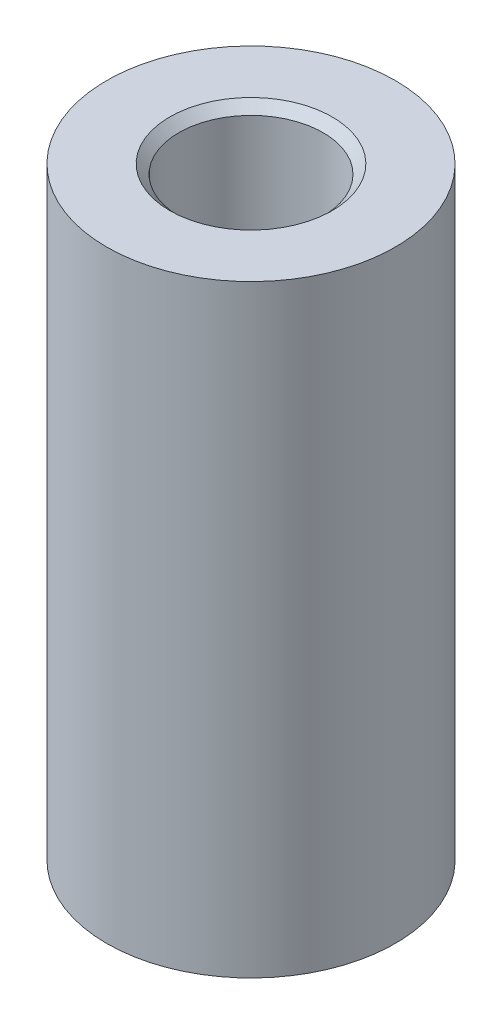
ISO-10303-21;
HEADER;
FILE_DESCRIPTION(('STEP AP214'),'2;1');
FILE_NAME('part.step','',(''),(''),'','','');
FILE_SCHEMA(('AUTOMOTIVE_DESIGN { 1 0 10303 214 1 1 1 1 }'));
ENDSEC;
DATA;
#1=APPLICATION_CONTEXT('core data for automotive mechanical design processes');
#2=APPLICATION_PROTOCOL_DEFINITION('international standard','automotive_design',2000,#1);
#3=PRODUCT_CONTEXT('',#1,'mechanical');
#4=PRODUCT('Part','Part','',(#3));
#5=PRODUCT_RELATED_PRODUCT_CATEGORY('part','',(#4));
#6=PRODUCT_DEFINITION_FORMATION('','',#4);
#7=PRODUCT_DEFINITION_CONTEXT('part definition',#1,'design');
#8=PRODUCT_DEFINITION('design','',#6,#7);
#9=PRODUCT_DEFINITION_SHAPE('','',#8);
#10=(LENGTH_UNIT() NAMED_UNIT(*) SI_UNIT(.MILLI.,.METRE.));
#11=(NAMED_UNIT(*) PLANE_ANGLE_UNIT() SI_UNIT($,.RADIAN.));
#12=(NAMED_UNIT(*) SI_UNIT($,.STERADIAN.) SOLID_ANGLE_UNIT());
#13=UNCERTAINTY_MEASURE_WITH_UNIT(LENGTH_MEASURE(1.E-05),#10,'distance_accuracy_value','');
#14=(GEOMETRIC_REPRESENTATION_CONTEXT(3) GLOBAL_UNCERTAINTY_ASSIGNED_CONTEXT((#13)) GLOBAL_UNIT_ASSIGNED_CONTEXT((#10,
#11,#12)) REPRESENTATION_CONTEXT('',''));
#15=CARTESIAN_POINT('',(0.,0.,0.));
#16=DIRECTION('',(0.,0.,1.));
#17=DIRECTION('',(1.,0.,0.));
#18=AXIS2_PLACEMENT_3D('',#15,#16,#17);
#19=CARTESIAN_POINT('',(0.,26.543,0.));
#20=DIRECTION('',(0.,1.,0.));
#21=DIRECTION('',(0.,0.,1.));
#22=AXIS2_PLACEMENT_3D('',#19,#20,#21);
#23=PLANE('',#22);
#24=CARTESIAN_POINT('',(0.,26.543,0.));
#25=DIRECTION('',(0.,1.,0.));
#26=DIRECTION('',(0.,0.,1.));
#27=AXIS2_PLACEMENT_3D('',#24,#25,#26);
#28=CIRCLE('',#27,3.575);
#29=CARTESIAN_POINT('',(0.,26.543,3.575));
#30=VERTEX_POINT('',#29);
#31=EDGE_CURVE('E10',#30,#30,#28,.F.);
#32=ORIENTED_EDGE('',*,*,#31,.T.);
#33=EDGE_LOOP('',(#32));
#34=FACE_BOUND('',#33,.T.);
#35=CARTESIAN_POINT('',(0.,26.543,0.));
#36=DIRECTION('',(0.,1.,0.));
#37=DIRECTION('',(0.,0.,1.));
#38=AXIS2_PLACEMENT_3D('',#35,#36,#37);
#39=CIRCLE('',#38,6.35);
#40=CARTESIAN_POINT('',(0.,26.543,6.35));
#41=VERTEX_POINT('',#40);
#42=EDGE_CURVE('E51',#41,#41,#39,.T.);
#43=ORIENTED_EDGE('',*,*,#42,.T.);
#44=EDGE_LOOP('',(#43));
#45=FACE_BOUND('',#44,.T.);
#46=ADVANCED_FACE('F31',(#34,#45),#23,.T.);
#47=CARTESIAN_POINT('',(0.,0.,0.));
#48=DIRECTION('',(0.,1.,0.));
#49=DIRECTION('',(0.,0.,1.));
#50=AXIS2_PLACEMENT_3D('',#47,#48,#49);
#51=PLANE('',#50);
#52=CARTESIAN_POINT('',(0.,0.,0.));
#53=DIRECTION('',(0.,1.,0.));
#54=DIRECTION('',(0.,0.,1.));
#55=AXIS2_PLACEMENT_3D('',#52,#53,#54);
#56=CIRCLE('',#55,3.575);
#57=CARTESIAN_POINT('',(0.,0.,3.575));
#58=VERTEX_POINT('',#57);
#59=EDGE_CURVE('E46',#58,#58,#56,.T.);
#60=ORIENTED_EDGE('',*,*,#59,.T.);
#61=EDGE_LOOP('',(#60));
#62=FACE_BOUND('',#61,.T.);
#63=CARTESIAN_POINT('',(0.,0.,0.));
#64=DIRECTION('',(0.,1.,0.));
#65=DIRECTION('',(0.,0.,1.));
#66=AXIS2_PLACEMENT_3D('',#63,#64,#65);
#67=CIRCLE('',#66,6.35);
#68=CARTESIAN_POINT('',(0.,0.,6.35));
#69=VERTEX_POINT('',#68);
#70=EDGE_CURVE('E52',#69,#69,#67,.T.);
#71=ORIENTED_EDGE('',*,*,#70,.F.);
#72=EDGE_LOOP('',(#71));
#73=FACE_BOUND('',#72,.T.);
#74=ADVANCED_FACE('F63',(#62,#73),#51,.F.);
#75=CARTESIAN_POINT('',(0.,26.543,0.));
#76=DIRECTION('',(0.,-1.,0.));
#77=DIRECTION('',(0.,0.,-1.));
#78=AXIS2_PLACEMENT_3D('',#75,#76,#77);
#79=CYLINDRICAL_SURFACE('',#78,6.35);
#80=ORIENTED_EDGE('',*,*,#42,.F.);
#81=EDGE_LOOP('',(#80));
#82=FACE_BOUND('',#81,.T.);
#83=ORIENTED_EDGE('',*,*,#70,.T.);
#84=EDGE_LOOP('',(#83));
#85=FACE_BOUND('',#84,.T.);
#86=ADVANCED_FACE('F59',(#82,#85),#79,.T.);
#87=CARTESIAN_POINT('',(0.,26.543,0.));
#88=DIRECTION('',(0.,-1.,0.));
#89=DIRECTION('',(0.,0.,-1.));
#90=AXIS2_PLACEMENT_3D('',#87,#88,#89);
#91=CYLINDRICAL_SURFACE('',#90,3.175);
#92=CARTESIAN_POINT('',(0.,0.400000000000005,0.));
#93=DIRECTION('',(0.,1.,0.));
#94=DIRECTION('',(0.,0.,1.));
#95=AXIS2_PLACEMENT_3D('',#92,#93,#94);
#96=CIRCLE('',#95,3.175);
#97=CARTESIAN_POINT('',(0.,0.400000000000005,3.175));
#98=VERTEX_POINT('',#97);
#99=EDGE_CURVE('E38',#98,#98,#96,.F.);
#100=ORIENTED_EDGE('',*,*,#99,.T.);
#101=EDGE_LOOP('',(#100));
#102=FACE_BOUND('',#101,.T.);
#103=CARTESIAN_POINT('',(0.,26.143,0.));
#104=DIRECTION('',(0.,1.,0.));
#105=DIRECTION('',(0.,0.,1.));
#106=AXIS2_PLACEMENT_3D('',#103,#104,#105);
#107=CIRCLE('',#106,3.175);
#108=CARTESIAN_POINT('',(0.,26.143,3.175));
#109=VERTEX_POINT('',#108);
#110=EDGE_CURVE('E42',#109,#109,#107,.T.);
#111=ORIENTED_EDGE('',*,*,#110,.T.);
#112=EDGE_LOOP('',(#111));
#113=FACE_BOUND('',#112,.T.);
#114=ADVANCED_FACE('F62',(#102,#113),#91,.F.);
#115=CARTESIAN_POINT('',(0.,0.,0.));
#116=DIRECTION('',(0.,-1.,0.));
#117=DIRECTION('',(0.,0.,-1.));
#118=AXIS2_PLACEMENT_3D('',#115,#116,#117);
#119=CONICAL_SURFACE('',#118,3.575,0.785398163397445);
#120=ORIENTED_EDGE('',*,*,#99,.F.);
#121=EDGE_LOOP('',(#120));
#122=FACE_BOUND('',#121,.T.);
#123=ORIENTED_EDGE('',*,*,#59,.F.);
#124=EDGE_LOOP('',(#123));
#125=FACE_BOUND('',#124,.T.);
#126=ADVANCED_FACE('F75',(#122,#125),#119,.F.);
#127=CARTESIAN_POINT('',(0.,26.143,0.));
#128=DIRECTION('',(0.,1.,0.));
#129=DIRECTION('',(0.,0.,1.));
#130=AXIS2_PLACEMENT_3D('',#127,#128,#129);
#131=CONICAL_SURFACE('',#130,3.175,0.785398163397449);
#132=ORIENTED_EDGE('',*,*,#31,.F.);
#133=EDGE_LOOP('',(#132));
#134=FACE_BOUND('',#133,.T.);
#135=ORIENTED_EDGE('',*,*,#110,.F.);
#136=EDGE_LOOP('',(#135));
#137=FACE_BOUND('',#136,.T.);
#138=ADVANCED_FACE('F33',(#134,#137),#131,.F.);
#139=CLOSED_SHELL('',(#46,#74,#86,#114,#126,#138));
#140=MANIFOLD_SOLID_BREP('B2',#139);
#141=ADVANCED_BREP_SHAPE_REPRESENTATION('',(#18,#140),#14);
#142=SHAPE_DEFINITION_REPRESENTATION(#9,#141);
ENDSEC;
END-ISO-10303-21;
